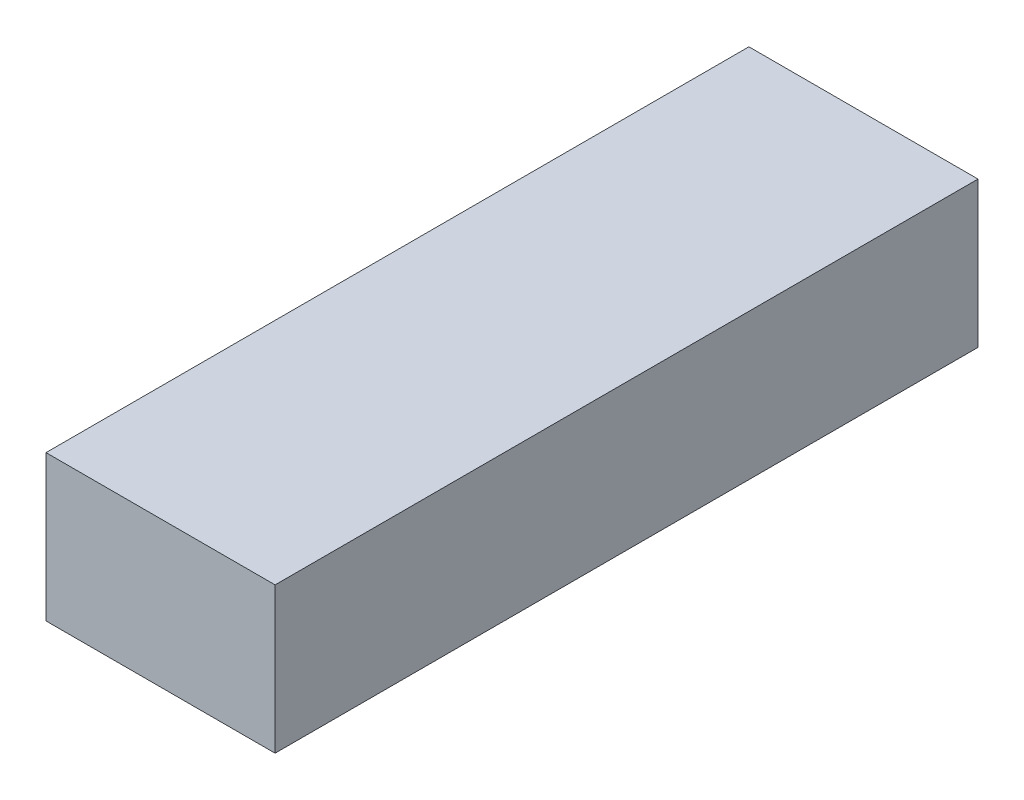
ISO-10303-21;
HEADER;
FILE_DESCRIPTION(('STEP AP214'),'2;1');
FILE_NAME('part.step','',(''),(''),'','','');
FILE_SCHEMA(('AUTOMOTIVE_DESIGN { 1 0 10303 214 1 1 1 1 }'));
ENDSEC;
DATA;
#1=APPLICATION_CONTEXT('core data for automotive mechanical design processes');
#2=APPLICATION_PROTOCOL_DEFINITION('international standard','automotive_design',2000,#1);
#3=PRODUCT_CONTEXT('',#1,'mechanical');
#4=PRODUCT('Part','Part','',(#3));
#5=PRODUCT_RELATED_PRODUCT_CATEGORY('part','',(#4));
#6=PRODUCT_DEFINITION_FORMATION('','',#4);
#7=PRODUCT_DEFINITION_CONTEXT('part definition',#1,'design');
#8=PRODUCT_DEFINITION('design','',#6,#7);
#9=PRODUCT_DEFINITION_SHAPE('','',#8);
#10=(LENGTH_UNIT() NAMED_UNIT(*) SI_UNIT(.MILLI.,.METRE.));
#11=(NAMED_UNIT(*) PLANE_ANGLE_UNIT() SI_UNIT($,.RADIAN.));
#12=(NAMED_UNIT(*) SI_UNIT($,.STERADIAN.) SOLID_ANGLE_UNIT());
#13=UNCERTAINTY_MEASURE_WITH_UNIT(LENGTH_MEASURE(1.E-05),#10,'distance_accuracy_value','');
#14=(GEOMETRIC_REPRESENTATION_CONTEXT(3) GLOBAL_UNCERTAINTY_ASSIGNED_CONTEXT((#13)) GLOBAL_UNIT_ASSIGNED_CONTEXT((#10,
#11,#12)) REPRESENTATION_CONTEXT('',''));
#15=CARTESIAN_POINT('',(0.,0.,0.));
#16=DIRECTION('',(0.,0.,1.));
#17=DIRECTION('',(1.,0.,0.));
#18=AXIS2_PLACEMENT_3D('',#15,#16,#17);
#19=CARTESIAN_POINT('',(0.,28.,0.));
#20=DIRECTION('',(1.,0.,0.));
#21=DIRECTION('',(0.,0.,-1.));
#22=AXIS2_PLACEMENT_3D('',#19,#20,#21);
#23=PLANE('',#22);
#24=DIRECTION('',(0.,0.,1.));
#25=VECTOR('',#24,1.);
#26=CARTESIAN_POINT('',(0.,0.,0.));
#27=LINE('',#26,#25);
#28=CARTESIAN_POINT('',(0.,0.,-135.));
#29=VERTEX_POINT('',#28);
#30=CARTESIAN_POINT('',(0.,0.,0.));
#31=VERTEX_POINT('',#30);
#32=EDGE_CURVE('E106',#29,#31,#27,.T.);
#33=ORIENTED_EDGE('',*,*,#32,.T.);
#34=DIRECTION('',(0.,-1.,0.));
#35=VECTOR('',#34,1.);
#36=CARTESIAN_POINT('',(0.,28.,0.));
#37=LINE('',#36,#35);
#38=CARTESIAN_POINT('',(0.,28.,0.));
#39=VERTEX_POINT('',#38);
#40=EDGE_CURVE('E11',#39,#31,#37,.T.);
#41=ORIENTED_EDGE('',*,*,#40,.F.);
#42=DIRECTION('',(0.,0.,1.));
#43=VECTOR('',#42,1.);
#44=CARTESIAN_POINT('',(0.,28.,0.));
#45=LINE('',#44,#43);
#46=CARTESIAN_POINT('',(0.,28.,-135.));
#47=VERTEX_POINT('',#46);
#48=EDGE_CURVE('E94',#47,#39,#45,.T.);
#49=ORIENTED_EDGE('',*,*,#48,.F.);
#50=DIRECTION('',(0.,-1.,0.));
#51=VECTOR('',#50,1.);
#52=CARTESIAN_POINT('',(0.,28.,-135.));
#53=LINE('',#52,#51);
#54=EDGE_CURVE('E102',#47,#29,#53,.T.);
#55=ORIENTED_EDGE('',*,*,#54,.T.);
#56=EDGE_LOOP('',(#33,#41,#49,#55));
#57=FACE_BOUND('',#56,.T.);
#58=ADVANCED_FACE('F43',(#57),#23,.F.);
#59=CARTESIAN_POINT('',(0.,28.,0.));
#60=DIRECTION('',(0.,0.,-1.));
#61=DIRECTION('',(-1.,0.,0.));
#62=AXIS2_PLACEMENT_3D('',#59,#60,#61);
#63=PLANE('',#62);
#64=DIRECTION('',(1.,0.,0.));
#65=VECTOR('',#64,1.);
#66=CARTESIAN_POINT('',(0.,0.,0.));
#67=LINE('',#66,#65);
#68=CARTESIAN_POINT('',(44.,0.,0.));
#69=VERTEX_POINT('',#68);
#70=EDGE_CURVE('E98',#31,#69,#67,.T.);
#71=ORIENTED_EDGE('',*,*,#70,.T.);
#72=DIRECTION('',(0.,-1.,0.));
#73=VECTOR('',#72,1.);
#74=CARTESIAN_POINT('',(44.,28.,0.));
#75=LINE('',#74,#73);
#76=CARTESIAN_POINT('',(44.,28.,0.));
#77=VERTEX_POINT('',#76);
#78=EDGE_CURVE('E51',#77,#69,#75,.T.);
#79=ORIENTED_EDGE('',*,*,#78,.F.);
#80=DIRECTION('',(1.,0.,0.));
#81=VECTOR('',#80,1.);
#82=CARTESIAN_POINT('',(0.,28.,0.));
#83=LINE('',#82,#81);
#84=EDGE_CURVE('E89',#39,#77,#83,.T.);
#85=ORIENTED_EDGE('',*,*,#84,.F.);
#86=ORIENTED_EDGE('',*,*,#40,.T.);
#87=EDGE_LOOP('',(#71,#79,#85,#86));
#88=FACE_BOUND('',#87,.T.);
#89=ADVANCED_FACE('F97',(#88),#63,.F.);
#90=CARTESIAN_POINT('',(44.,28.,0.));
#91=DIRECTION('',(-1.,0.,0.));
#92=DIRECTION('',(0.,0.,1.));
#93=AXIS2_PLACEMENT_3D('',#90,#91,#92);
#94=PLANE('',#93);
#95=DIRECTION('',(0.,0.,-1.));
#96=VECTOR('',#95,1.);
#97=CARTESIAN_POINT('',(44.,0.,0.));
#98=LINE('',#97,#96);
#99=CARTESIAN_POINT('',(44.,0.,-135.));
#100=VERTEX_POINT('',#99);
#101=EDGE_CURVE('E76',#69,#100,#98,.T.);
#102=ORIENTED_EDGE('',*,*,#101,.T.);
#103=DIRECTION('',(0.,-1.,0.));
#104=VECTOR('',#103,1.);
#105=CARTESIAN_POINT('',(44.,28.,-135.));
#106=LINE('',#105,#104);
#107=CARTESIAN_POINT('',(44.,28.,-135.));
#108=VERTEX_POINT('',#107);
#109=EDGE_CURVE('E99',#108,#100,#106,.T.);
#110=ORIENTED_EDGE('',*,*,#109,.F.);
#111=DIRECTION('',(0.,0.,-1.));
#112=VECTOR('',#111,1.);
#113=CARTESIAN_POINT('',(44.,28.,0.));
#114=LINE('',#113,#112);
#115=EDGE_CURVE('E92',#77,#108,#114,.T.);
#116=ORIENTED_EDGE('',*,*,#115,.F.);
#117=ORIENTED_EDGE('',*,*,#78,.T.);
#118=EDGE_LOOP('',(#102,#110,#116,#117));
#119=FACE_BOUND('',#118,.T.);
#120=ADVANCED_FACE('F100',(#119),#94,.F.);
#121=CARTESIAN_POINT('',(0.,28.,-135.));
#122=DIRECTION('',(0.,0.,1.));
#123=DIRECTION('',(1.,0.,0.));
#124=AXIS2_PLACEMENT_3D('',#121,#122,#123);
#125=PLANE('',#124);
#126=DIRECTION('',(-1.,0.,0.));
#127=VECTOR('',#126,1.);
#128=CARTESIAN_POINT('',(0.,0.,-135.));
#129=LINE('',#128,#127);
#130=EDGE_CURVE('E82',#100,#29,#129,.T.);
#131=ORIENTED_EDGE('',*,*,#130,.T.);
#132=ORIENTED_EDGE('',*,*,#54,.F.);
#133=DIRECTION('',(-1.,0.,0.));
#134=VECTOR('',#133,1.);
#135=CARTESIAN_POINT('',(0.,28.,-135.));
#136=LINE('',#135,#134);
#137=EDGE_CURVE('E59',#108,#47,#136,.T.);
#138=ORIENTED_EDGE('',*,*,#137,.F.);
#139=ORIENTED_EDGE('',*,*,#109,.T.);
#140=EDGE_LOOP('',(#131,#132,#138,#139));
#141=FACE_BOUND('',#140,.T.);
#142=ADVANCED_FACE('F113',(#141),#125,.F.);
#143=CARTESIAN_POINT('',(0.,28.,0.));
#144=DIRECTION('',(0.,-1.,0.));
#145=DIRECTION('',(0.,0.,-1.));
#146=AXIS2_PLACEMENT_3D('',#143,#144,#145);
#147=PLANE('',#146);
#148=ORIENTED_EDGE('',*,*,#48,.T.);
#149=ORIENTED_EDGE('',*,*,#84,.T.);
#150=ORIENTED_EDGE('',*,*,#115,.T.);
#151=ORIENTED_EDGE('',*,*,#137,.T.);
#152=EDGE_LOOP('',(#148,#149,#150,#151));
#153=FACE_BOUND('',#152,.T.);
#154=ADVANCED_FACE('F90',(#153),#147,.F.);
#155=CARTESIAN_POINT('',(0.,0.,0.));
#156=DIRECTION('',(0.,-1.,0.));
#157=DIRECTION('',(0.,0.,-1.));
#158=AXIS2_PLACEMENT_3D('',#155,#156,#157);
#159=PLANE('',#158);
#160=ORIENTED_EDGE('',*,*,#32,.F.);
#161=ORIENTED_EDGE('',*,*,#130,.F.);
#162=ORIENTED_EDGE('',*,*,#101,.F.);
#163=ORIENTED_EDGE('',*,*,#70,.F.);
#164=EDGE_LOOP('',(#160,#161,#162,#163));
#165=FACE_BOUND('',#164,.T.);
#166=ADVANCED_FACE('F116',(#165),#159,.T.);
#167=CLOSED_SHELL('',(#58,#89,#120,#142,#154,#166));
#168=MANIFOLD_SOLID_BREP('B2',#167);
#169=ADVANCED_BREP_SHAPE_REPRESENTATION('',(#18,#168),#14);
#170=SHAPE_DEFINITION_REPRESENTATION(#9,#169);
ENDSEC;
END-ISO-10303-21;
